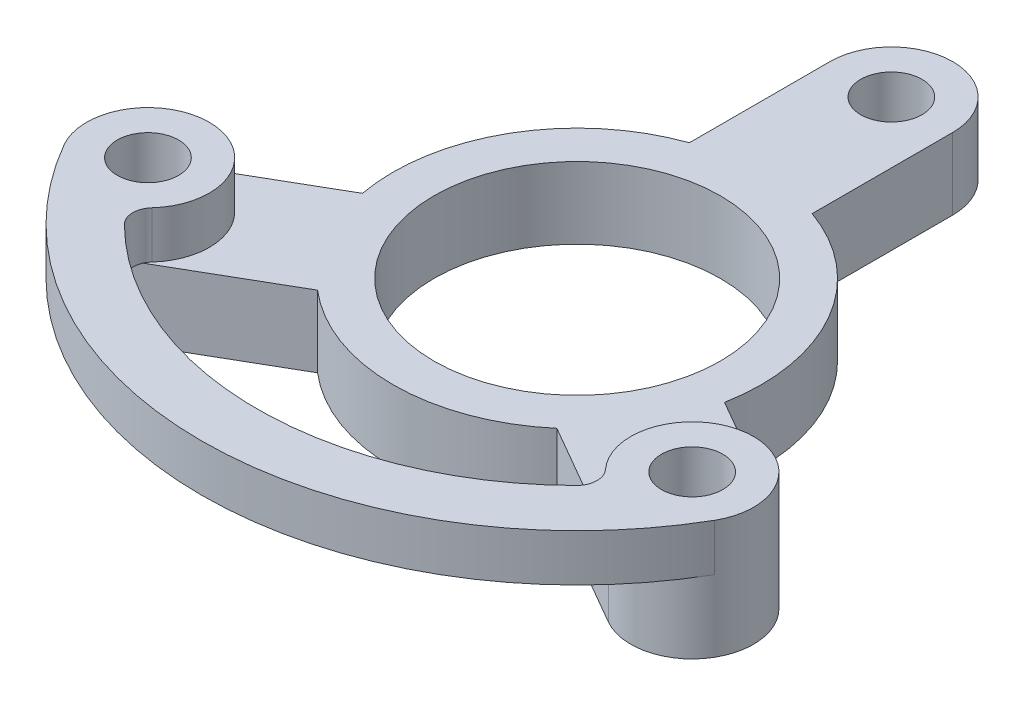
ISO-10303-21;
HEADER;
FILE_DESCRIPTION(('STEP AP214'),'2;1');
FILE_NAME('part.step','',(''),(''),'','','');
FILE_SCHEMA(('AUTOMOTIVE_DESIGN { 1 0 10303 214 1 1 1 1 }'));
ENDSEC;
DATA;
#1=APPLICATION_CONTEXT('core data for automotive mechanical design processes');
#2=APPLICATION_PROTOCOL_DEFINITION('international standard','automotive_design',2000,#1);
#3=PRODUCT_CONTEXT('',#1,'mechanical');
#4=PRODUCT('Part','Part','',(#3));
#5=PRODUCT_RELATED_PRODUCT_CATEGORY('part','',(#4));
#6=PRODUCT_DEFINITION_FORMATION('','',#4);
#7=PRODUCT_DEFINITION_CONTEXT('part definition',#1,'design');
#8=PRODUCT_DEFINITION('design','',#6,#7);
#9=PRODUCT_DEFINITION_SHAPE('','',#8);
#10=(LENGTH_UNIT() NAMED_UNIT(*) SI_UNIT(.MILLI.,.METRE.));
#11=(NAMED_UNIT(*) PLANE_ANGLE_UNIT() SI_UNIT($,.RADIAN.));
#12=(NAMED_UNIT(*) SI_UNIT($,.STERADIAN.) SOLID_ANGLE_UNIT());
#13=UNCERTAINTY_MEASURE_WITH_UNIT(LENGTH_MEASURE(1.E-05),#10,'distance_accuracy_value','');
#14=(GEOMETRIC_REPRESENTATION_CONTEXT(3) GLOBAL_UNCERTAINTY_ASSIGNED_CONTEXT((#13)) GLOBAL_UNIT_ASSIGNED_CONTEXT((#10,
#11,#12)) REPRESENTATION_CONTEXT('',''));
#15=CARTESIAN_POINT('',(0.,0.,0.));
#16=DIRECTION('',(0.,0.,1.));
#17=DIRECTION('',(1.,0.,0.));
#18=AXIS2_PLACEMENT_3D('',#15,#16,#17);
#19=CARTESIAN_POINT('',(0.,3.5,0.));
#20=DIRECTION('',(0.,-1.,0.));
#21=DIRECTION('',(0.,0.,-1.));
#22=AXIS2_PLACEMENT_3D('',#19,#20,#21);
#23=CYLINDRICAL_SURFACE('',#22,9.);
#24=CARTESIAN_POINT('',(0.,0.,0.));
#25=DIRECTION('',(0.,1.,0.));
#26=DIRECTION('',(0.,0.,1.));
#27=AXIS2_PLACEMENT_3D('',#24,#25,#26);
#28=CIRCLE('',#27,9.);
#29=CARTESIAN_POINT('',(-5.84846922834953,0.,6.8407168984726));
#30=VERTEX_POINT('',#29);
#31=CARTESIAN_POINT('',(5.84846922834954,0.,6.8407168984726));
#32=VERTEX_POINT('',#31);
#33=EDGE_CURVE('E204',#30,#32,#28,.T.);
#34=ORIENTED_EDGE('',*,*,#33,.T.);
#35=DIRECTION('',(0.,-1.,0.));
#36=VECTOR('',#35,1.);
#37=CARTESIAN_POINT('',(5.84846922834954,3.5,6.8407168984726));
#38=LINE('',#37,#36);
#39=CARTESIAN_POINT('',(5.84846922834954,3.5,6.8407168984726));
#40=VERTEX_POINT('',#39);
#41=EDGE_CURVE('E310',#40,#32,#38,.T.);
#42=ORIENTED_EDGE('',*,*,#41,.F.);
#43=CARTESIAN_POINT('',(0.,3.5,0.));
#44=DIRECTION('',(0.,1.,0.));
#45=DIRECTION('',(0.,0.,1.));
#46=AXIS2_PLACEMENT_3D('',#43,#44,#45);
#47=CIRCLE('',#46,9.);
#48=CARTESIAN_POINT('',(-5.84846922834953,3.5,6.8407168984726));
#49=VERTEX_POINT('',#48);
#50=EDGE_CURVE('E213',#49,#40,#47,.T.);
#51=ORIENTED_EDGE('',*,*,#50,.F.);
#52=DIRECTION('',(0.,-1.,0.));
#53=VECTOR('',#52,1.);
#54=CARTESIAN_POINT('',(-5.84846922834953,3.5,6.8407168984726));
#55=LINE('',#54,#53);
#56=EDGE_CURVE('E246',#49,#30,#55,.T.);
#57=ORIENTED_EDGE('',*,*,#56,.T.);
#58=EDGE_LOOP('',(#34,#42,#51,#57));
#59=FACE_BOUND('',#58,.T.);
#60=ADVANCED_FACE('F46',(#59),#23,.T.);
#61=CARTESIAN_POINT('',(-1.5,3.5,2.59807621135332));
#62=DIRECTION('',(0.5,0.,-0.866025403784439));
#63=DIRECTION('',(-0.866025403784439,0.,-0.5));
#64=AXIS2_PLACEMENT_3D('',#61,#62,#63);
#65=PLANE('',#64);
#66=DIRECTION('',(0.866025403784439,0.,0.5));
#67=VECTOR('',#66,1.);
#68=CARTESIAN_POINT('',(-1.5,0.,2.59807621135332));
#69=LINE('',#68,#67);
#70=CARTESIAN_POINT('',(11.8,0.,10.2768347915753));
#71=VERTEX_POINT('',#70);
#72=EDGE_CURVE('E250',#32,#71,#69,.T.);
#73=ORIENTED_EDGE('',*,*,#72,.T.);
#74=DIRECTION('',(0.,-1.,0.));
#75=VECTOR('',#74,1.);
#76=CARTESIAN_POINT('',(11.8,3.5,10.2768347915753));
#77=LINE('',#76,#75);
#78=CARTESIAN_POINT('',(11.8,3.5,10.2768347915753));
#79=VERTEX_POINT('',#78);
#80=EDGE_CURVE('E307',#79,#71,#77,.T.);
#81=ORIENTED_EDGE('',*,*,#80,.F.);
#82=DIRECTION('',(0.866025403784439,0.,0.5));
#83=VECTOR('',#82,1.);
#84=CARTESIAN_POINT('',(-1.5,3.5,2.59807621135332));
#85=LINE('',#84,#83);
#86=CARTESIAN_POINT('',(11.2548002587851,3.5,9.96206357422279));
#87=VERTEX_POINT('',#86);
#88=EDGE_CURVE('E61',#87,#79,#85,.T.);
#89=ORIENTED_EDGE('',*,*,#88,.F.);
#90=EDGE_CURVE('E219',#40,#87,#85,.T.);
#91=ORIENTED_EDGE('',*,*,#90,.F.);
#92=ORIENTED_EDGE('',*,*,#41,.T.);
#93=EDGE_LOOP('',(#73,#81,#89,#91,#92));
#94=FACE_BOUND('',#93,.T.);
#95=ADVANCED_FACE('F339',(#94),#65,.F.);
#96=CARTESIAN_POINT('',(13.3,3.5,7.67875858022203));
#97=DIRECTION('',(0.,-1.,0.));
#98=DIRECTION('',(0.,0.,-1.));
#99=AXIS2_PLACEMENT_3D('',#96,#97,#98);
#100=CYLINDRICAL_SURFACE('',#99,3.);
#101=CARTESIAN_POINT('',(13.3,3.5,7.67875858022203));
#102=DIRECTION('',(0.,1.,0.));
#103=DIRECTION('',(0.,0.,1.));
#104=AXIS2_PLACEMENT_3D('',#101,#102,#103);
#105=CIRCLE('',#104,3.);
#106=CARTESIAN_POINT('',(14.8,3.5,5.0806823688687));
#107=VERTEX_POINT('',#106);
#108=CARTESIAN_POINT('',(11.0821067917896,3.5,9.69889464419747));
#109=VERTEX_POINT('',#108);
#110=EDGE_CURVE('E313',#107,#109,#105,.T.);
#111=ORIENTED_EDGE('',*,*,#110,.T.);
#112=DIRECTION('',(0.,-1.,0.));
#113=VECTOR('',#112,1.);
#114=CARTESIAN_POINT('',(11.0821067917896,3.5,9.69889464419747));
#115=LINE('',#114,#113);
#116=CARTESIAN_POINT('',(11.0821067917896,5.8,9.69889464419747));
#117=VERTEX_POINT('',#116);
#118=EDGE_CURVE('E69',#109,#117,#115,.F.);
#119=ORIENTED_EDGE('',*,*,#118,.T.);
#120=CARTESIAN_POINT('',(13.3,5.8,7.67875858022203));
#121=DIRECTION('',(0.,1.,0.));
#122=DIRECTION('',(0.,0.,1.));
#123=AXIS2_PLACEMENT_3D('',#120,#121,#122);
#124=CIRCLE('',#123,3.);
#125=CARTESIAN_POINT('',(15.8980762113533,5.8,9.17875858022203));
#126=VERTEX_POINT('',#125);
#127=EDGE_CURVE('E175',#126,#117,#124,.T.);
#128=ORIENTED_EDGE('',*,*,#127,.F.);
#129=DIRECTION('',(0.,-1.,0.));
#130=VECTOR('',#129,1.);
#131=CARTESIAN_POINT('',(15.8980762113533,5.8,9.17875858022203));
#132=LINE('',#131,#130);
#133=CARTESIAN_POINT('',(15.8980762113533,3.5,9.17875858022203));
#134=VERTEX_POINT('',#133);
#135=EDGE_CURVE('E180',#126,#134,#132,.T.);
#136=ORIENTED_EDGE('',*,*,#135,.T.);
#137=CARTESIAN_POINT('',(13.3,3.5,7.67875858022203));
#138=DIRECTION('',(0.,1.,0.));
#139=DIRECTION('',(0.,0.,1.));
#140=AXIS2_PLACEMENT_3D('',#137,#138,#139);
#141=CIRCLE('',#140,3.);
#142=EDGE_CURVE('E222',#79,#134,#141,.T.);
#143=ORIENTED_EDGE('',*,*,#142,.F.);
#144=ORIENTED_EDGE('',*,*,#80,.T.);
#145=CARTESIAN_POINT('',(13.3,0.,7.67875858022203));
#146=DIRECTION('',(0.,1.,0.));
#147=DIRECTION('',(0.,0.,1.));
#148=AXIS2_PLACEMENT_3D('',#145,#146,#147);
#149=CIRCLE('',#148,3.);
#150=CARTESIAN_POINT('',(14.8,0.,5.0806823688687));
#151=VERTEX_POINT('',#150);
#152=EDGE_CURVE('E254',#71,#151,#149,.T.);
#153=ORIENTED_EDGE('',*,*,#152,.T.);
#154=DIRECTION('',(0.,-1.,0.));
#155=VECTOR('',#154,1.);
#156=CARTESIAN_POINT('',(14.8,3.5,5.0806823688687));
#157=LINE('',#156,#155);
#158=EDGE_CURVE('E305',#107,#151,#157,.T.);
#159=ORIENTED_EDGE('',*,*,#158,.F.);
#160=EDGE_LOOP('',(#111,#119,#128,#136,#143,#144,#153,#159));
#161=FACE_BOUND('',#160,.T.);
#162=ADVANCED_FACE('F177',(#161),#100,.T.);
#163=CARTESIAN_POINT('',(1.5,3.5,-2.59807621135332));
#164=DIRECTION('',(0.5,0.,-0.866025403784439));
#165=DIRECTION('',(-0.866025403784439,0.,-0.5));
#166=AXIS2_PLACEMENT_3D('',#163,#164,#165);
#167=PLANE('',#166);
#168=DIRECTION('',(0.866025403784439,0.,0.5));
#169=VECTOR('',#168,1.);
#170=CARTESIAN_POINT('',(1.5,0.,-2.59807621135332));
#171=LINE('',#170,#169);
#172=CARTESIAN_POINT('',(8.84846922834953,0.,1.64456447576597));
#173=VERTEX_POINT('',#172);
#174=EDGE_CURVE('E257',#173,#151,#171,.T.);
#175=ORIENTED_EDGE('',*,*,#174,.F.);
#176=DIRECTION('',(0.,-1.,0.));
#177=VECTOR('',#176,1.);
#178=CARTESIAN_POINT('',(8.84846922834953,3.5,1.64456447576597));
#179=LINE('',#178,#177);
#180=CARTESIAN_POINT('',(8.84846922834953,3.5,1.64456447576597));
#181=VERTEX_POINT('',#180);
#182=EDGE_CURVE('E303',#181,#173,#179,.T.);
#183=ORIENTED_EDGE('',*,*,#182,.F.);
#184=DIRECTION('',(0.866025403784439,0.,0.5));
#185=VECTOR('',#184,1.);
#186=CARTESIAN_POINT('',(1.5,3.5,-2.59807621135332));
#187=LINE('',#186,#185);
#188=EDGE_CURVE('E224',#181,#107,#187,.T.);
#189=ORIENTED_EDGE('',*,*,#188,.T.);
#190=ORIENTED_EDGE('',*,*,#158,.T.);
#191=EDGE_LOOP('',(#175,#183,#189,#190));
#192=FACE_BOUND('',#191,.T.);
#193=ADVANCED_FACE('F390',(#192),#167,.T.);
#194=CARTESIAN_POINT('',(3.,0.,-8.48528137423857));
#195=VERTEX_POINT('',#194);
#196=EDGE_CURVE('E252',#173,#195,#28,.T.);
#197=ORIENTED_EDGE('',*,*,#196,.T.);
#198=DIRECTION('',(0.,-1.,0.));
#199=VECTOR('',#198,1.);
#200=CARTESIAN_POINT('',(3.,3.5,-8.48528137423857));
#201=LINE('',#200,#199);
#202=CARTESIAN_POINT('',(3.,3.5,-8.48528137423857));
#203=VERTEX_POINT('',#202);
#204=EDGE_CURVE('E300',#203,#195,#201,.T.);
#205=ORIENTED_EDGE('',*,*,#204,.F.);
#206=EDGE_CURVE('E218',#181,#203,#47,.T.);
#207=ORIENTED_EDGE('',*,*,#206,.F.);
#208=ORIENTED_EDGE('',*,*,#182,.T.);
#209=EDGE_LOOP('',(#197,#205,#207,#208));
#210=FACE_BOUND('',#209,.T.);
#211=ADVANCED_FACE('F397',(#210),#23,.T.);
#212=CARTESIAN_POINT('',(3.,3.5,0.));
#213=DIRECTION('',(-1.,0.,0.));
#214=DIRECTION('',(0.,0.,1.));
#215=AXIS2_PLACEMENT_3D('',#212,#213,#214);
#216=PLANE('',#215);
#217=DIRECTION('',(0.,0.,-1.));
#218=VECTOR('',#217,1.);
#219=CARTESIAN_POINT('',(3.,0.,0.));
#220=LINE('',#219,#218);
#221=CARTESIAN_POINT('',(3.,0.,-15.357517160444));
#222=VERTEX_POINT('',#221);
#223=EDGE_CURVE('E260',#195,#222,#220,.T.);
#224=ORIENTED_EDGE('',*,*,#223,.T.);
#225=DIRECTION('',(0.,-1.,0.));
#226=VECTOR('',#225,1.);
#227=CARTESIAN_POINT('',(3.,3.5,-15.357517160444));
#228=LINE('',#227,#226);
#229=CARTESIAN_POINT('',(3.,3.5,-15.357517160444));
#230=VERTEX_POINT('',#229);
#231=EDGE_CURVE('E297',#230,#222,#228,.T.);
#232=ORIENTED_EDGE('',*,*,#231,.F.);
#233=DIRECTION('',(0.,0.,-1.));
#234=VECTOR('',#233,1.);
#235=CARTESIAN_POINT('',(3.,3.5,0.));
#236=LINE('',#235,#234);
#237=EDGE_CURVE('E227',#203,#230,#236,.T.);
#238=ORIENTED_EDGE('',*,*,#237,.F.);
#239=ORIENTED_EDGE('',*,*,#204,.T.);
#240=EDGE_LOOP('',(#224,#232,#238,#239));
#241=FACE_BOUND('',#240,.T.);
#242=ADVANCED_FACE('F399',(#241),#216,.F.);
#243=CARTESIAN_POINT('',(0.,3.5,-15.357517160444));
#244=DIRECTION('',(0.,-1.,0.));
#245=DIRECTION('',(0.,0.,-1.));
#246=AXIS2_PLACEMENT_3D('',#243,#244,#245);
#247=CYLINDRICAL_SURFACE('',#246,3.);
#248=CARTESIAN_POINT('',(0.,0.,-15.357517160444));
#249=DIRECTION('',(0.,1.,0.));
#250=DIRECTION('',(0.,0.,1.));
#251=AXIS2_PLACEMENT_3D('',#248,#249,#250);
#252=CIRCLE('',#251,3.);
#253=CARTESIAN_POINT('',(-3.,0.,-15.3575171604441));
#254=VERTEX_POINT('',#253);
#255=EDGE_CURVE('E262',#222,#254,#252,.T.);
#256=ORIENTED_EDGE('',*,*,#255,.T.);
#257=DIRECTION('',(0.,-1.,0.));
#258=VECTOR('',#257,1.);
#259=CARTESIAN_POINT('',(-3.,3.5,-15.3575171604441));
#260=LINE('',#259,#258);
#261=CARTESIAN_POINT('',(-3.,3.5,-15.3575171604441));
#262=VERTEX_POINT('',#261);
#263=EDGE_CURVE('E295',#262,#254,#260,.T.);
#264=ORIENTED_EDGE('',*,*,#263,.F.);
#265=CARTESIAN_POINT('',(0.,3.5,-15.357517160444));
#266=DIRECTION('',(0.,1.,0.));
#267=DIRECTION('',(0.,0.,1.));
#268=AXIS2_PLACEMENT_3D('',#265,#266,#267);
#269=CIRCLE('',#268,3.);
#270=EDGE_CURVE('E229',#230,#262,#269,.T.);
#271=ORIENTED_EDGE('',*,*,#270,.F.);
#272=ORIENTED_EDGE('',*,*,#231,.T.);
#273=EDGE_LOOP('',(#256,#264,#271,#272));
#274=FACE_BOUND('',#273,.T.);
#275=ADVANCED_FACE('F404',(#274),#247,.T.);
#276=CARTESIAN_POINT('',(-2.99999999999999,3.5,0.));
#277=DIRECTION('',(-1.,0.,0.));
#278=DIRECTION('',(0.,0.,1.));
#279=AXIS2_PLACEMENT_3D('',#276,#277,#278);
#280=PLANE('',#279);
#281=DIRECTION('',(0.,0.,-1.));
#282=VECTOR('',#281,1.);
#283=CARTESIAN_POINT('',(-2.99999999999999,0.,0.));
#284=LINE('',#283,#282);
#285=CARTESIAN_POINT('',(-3.,0.,-8.48528137423857));
#286=VERTEX_POINT('',#285);
#287=EDGE_CURVE('E265',#286,#254,#284,.T.);
#288=ORIENTED_EDGE('',*,*,#287,.F.);
#289=DIRECTION('',(0.,-1.,0.));
#290=VECTOR('',#289,1.);
#291=CARTESIAN_POINT('',(-3.,3.5,-8.48528137423857));
#292=LINE('',#291,#290);
#293=CARTESIAN_POINT('',(-3.,3.5,-8.48528137423857));
#294=VERTEX_POINT('',#293);
#295=EDGE_CURVE('E293',#294,#286,#292,.T.);
#296=ORIENTED_EDGE('',*,*,#295,.F.);
#297=DIRECTION('',(0.,0.,-1.));
#298=VECTOR('',#297,1.);
#299=CARTESIAN_POINT('',(-2.99999999999999,3.5,0.));
#300=LINE('',#299,#298);
#301=EDGE_CURVE('E231',#294,#262,#300,.T.);
#302=ORIENTED_EDGE('',*,*,#301,.T.);
#303=ORIENTED_EDGE('',*,*,#263,.T.);
#304=EDGE_LOOP('',(#288,#296,#302,#303));
#305=FACE_BOUND('',#304,.T.);
#306=ADVANCED_FACE('F406',(#305),#280,.T.);
#307=CARTESIAN_POINT('',(-8.84846922834953,0.,1.64456447576597));
#308=VERTEX_POINT('',#307);
#309=EDGE_CURVE('E251',#286,#308,#28,.T.);
#310=ORIENTED_EDGE('',*,*,#309,.T.);
#311=DIRECTION('',(0.,-1.,0.));
#312=VECTOR('',#311,1.);
#313=CARTESIAN_POINT('',(-8.84846922834953,3.5,1.64456447576597));
#314=LINE('',#313,#312);
#315=CARTESIAN_POINT('',(-8.84846922834953,3.5,1.64456447576597));
#316=VERTEX_POINT('',#315);
#317=EDGE_CURVE('E290',#316,#308,#314,.T.);
#318=ORIENTED_EDGE('',*,*,#317,.F.);
#319=EDGE_CURVE('E217',#294,#316,#47,.T.);
#320=ORIENTED_EDGE('',*,*,#319,.F.);
#321=ORIENTED_EDGE('',*,*,#295,.T.);
#322=EDGE_LOOP('',(#310,#318,#320,#321));
#323=FACE_BOUND('',#322,.T.);
#324=ADVANCED_FACE('F408',(#323),#23,.T.);
#325=CARTESIAN_POINT('',(-1.5,3.5,-2.59807621135332));
#326=DIRECTION('',(0.5,0.,0.866025403784438));
#327=DIRECTION('',(0.866025403784438,0.,-0.5));
#328=AXIS2_PLACEMENT_3D('',#325,#326,#327);
#329=PLANE('',#328);
#330=DIRECTION('',(-0.866025403784438,0.,0.5));
#331=VECTOR('',#330,1.);
#332=CARTESIAN_POINT('',(-1.5,0.,-2.59807621135332));
#333=LINE('',#332,#331);
#334=CARTESIAN_POINT('',(-14.8,0.,5.08068236886871));
#335=VERTEX_POINT('',#334);
#336=EDGE_CURVE('E268',#308,#335,#333,.T.);
#337=ORIENTED_EDGE('',*,*,#336,.T.);
#338=DIRECTION('',(0.,-1.,0.));
#339=VECTOR('',#338,1.);
#340=CARTESIAN_POINT('',(-14.8,3.5,5.08068236886871));
#341=LINE('',#340,#339);
#342=CARTESIAN_POINT('',(-14.8,3.5,5.08068236886871));
#343=VERTEX_POINT('',#342);
#344=EDGE_CURVE('E287',#343,#335,#341,.T.);
#345=ORIENTED_EDGE('',*,*,#344,.F.);
#346=DIRECTION('',(-0.866025403784438,0.,0.5));
#347=VECTOR('',#346,1.);
#348=CARTESIAN_POINT('',(-1.5,3.5,-2.59807621135332));
#349=LINE('',#348,#347);
#350=EDGE_CURVE('E234',#316,#343,#349,.T.);
#351=ORIENTED_EDGE('',*,*,#350,.F.);
#352=ORIENTED_EDGE('',*,*,#317,.T.);
#353=EDGE_LOOP('',(#337,#345,#351,#352));
#354=FACE_BOUND('',#353,.T.);
#355=ADVANCED_FACE('F373',(#354),#329,.F.);
#356=CARTESIAN_POINT('',(-13.3,3.5,7.67875858022203));
#357=DIRECTION('',(0.,-1.,0.));
#358=DIRECTION('',(0.,0.,-1.));
#359=AXIS2_PLACEMENT_3D('',#356,#357,#358);
#360=CYLINDRICAL_SURFACE('',#359,3.);
#361=CARTESIAN_POINT('',(-13.3,5.8,7.67875858022203));
#362=DIRECTION('',(0.,1.,0.));
#363=DIRECTION('',(0.,0.,1.));
#364=AXIS2_PLACEMENT_3D('',#361,#362,#363);
#365=CIRCLE('',#364,3.);
#366=CARTESIAN_POINT('',(-11.0821067917896,5.8,9.69889464419747));
#367=VERTEX_POINT('',#366);
#368=CARTESIAN_POINT('',(-15.8980762113533,5.8,9.17875858022203));
#369=VERTEX_POINT('',#368);
#370=EDGE_CURVE('E191',#367,#369,#365,.T.);
#371=ORIENTED_EDGE('',*,*,#370,.F.);
#372=DIRECTION('',(0.,-1.,0.));
#373=VECTOR('',#372,1.);
#374=CARTESIAN_POINT('',(-11.0821067917896,3.5,9.69889464419747));
#375=LINE('',#374,#373);
#376=CARTESIAN_POINT('',(-11.0821067917896,3.5,9.69889464419747));
#377=VERTEX_POINT('',#376);
#378=EDGE_CURVE('E314',#367,#377,#375,.T.);
#379=ORIENTED_EDGE('',*,*,#378,.T.);
#380=CARTESIAN_POINT('',(-13.3,3.5,7.67875858022203));
#381=DIRECTION('',(0.,1.,0.));
#382=DIRECTION('',(0.,0.,1.));
#383=AXIS2_PLACEMENT_3D('',#380,#381,#382);
#384=CIRCLE('',#383,3.);
#385=EDGE_CURVE('E195',#377,#343,#384,.T.);
#386=ORIENTED_EDGE('',*,*,#385,.T.);
#387=ORIENTED_EDGE('',*,*,#344,.T.);
#388=CARTESIAN_POINT('',(-13.3,0.,7.67875858022203));
#389=DIRECTION('',(0.,1.,0.));
#390=DIRECTION('',(0.,0.,1.));
#391=AXIS2_PLACEMENT_3D('',#388,#389,#390);
#392=CIRCLE('',#391,3.);
#393=CARTESIAN_POINT('',(-11.8,0.,10.2768347915753));
#394=VERTEX_POINT('',#393);
#395=EDGE_CURVE('E270',#335,#394,#392,.T.);
#396=ORIENTED_EDGE('',*,*,#395,.T.);
#397=DIRECTION('',(0.,-1.,0.));
#398=VECTOR('',#397,1.);
#399=CARTESIAN_POINT('',(-11.8,3.5,10.2768347915753));
#400=LINE('',#399,#398);
#401=CARTESIAN_POINT('',(-11.8,3.5,10.2768347915753));
#402=VERTEX_POINT('',#401);
#403=EDGE_CURVE('E285',#402,#394,#400,.T.);
#404=ORIENTED_EDGE('',*,*,#403,.F.);
#405=CARTESIAN_POINT('',(-13.3,3.5,7.67875858022203));
#406=DIRECTION('',(0.,1.,0.));
#407=DIRECTION('',(0.,0.,1.));
#408=AXIS2_PLACEMENT_3D('',#405,#406,#407);
#409=CIRCLE('',#408,3.);
#410=CARTESIAN_POINT('',(-15.8980762113533,3.5,9.17875858022203));
#411=VERTEX_POINT('',#410);
#412=EDGE_CURVE('E237',#411,#402,#409,.T.);
#413=ORIENTED_EDGE('',*,*,#412,.F.);
#414=DIRECTION('',(0.,-1.,0.));
#415=VECTOR('',#414,1.);
#416=CARTESIAN_POINT('',(-15.8980762113533,5.8,9.17875858022203));
#417=LINE('',#416,#415);
#418=EDGE_CURVE('E201',#369,#411,#417,.T.);
#419=ORIENTED_EDGE('',*,*,#418,.F.);
#420=EDGE_LOOP('',(#371,#379,#386,#387,#396,#404,#413,#419));
#421=FACE_BOUND('',#420,.T.);
#422=ADVANCED_FACE('F364',(#421),#360,.T.);
#423=CARTESIAN_POINT('',(0.,3.5,-15.357517160444));
#424=DIRECTION('',(0.,-1.,0.));
#425=DIRECTION('',(0.,0.,-1.));
#426=AXIS2_PLACEMENT_3D('',#423,#424,#425);
#427=CYLINDRICAL_SURFACE('',#426,1.5);
#428=CARTESIAN_POINT('',(0.,3.5,-15.357517160444));
#429=DIRECTION('',(0.,1.,0.));
#430=DIRECTION('',(0.,0.,1.));
#431=AXIS2_PLACEMENT_3D('',#428,#429,#430);
#432=CIRCLE('',#431,1.5);
#433=CARTESIAN_POINT('',(0.,3.5,-13.857517160444));
#434=VERTEX_POINT('',#433);
#435=EDGE_CURVE('E244',#434,#434,#432,.T.);
#436=ORIENTED_EDGE('',*,*,#435,.T.);
#437=EDGE_LOOP('',(#436));
#438=FACE_BOUND('',#437,.T.);
#439=CARTESIAN_POINT('',(0.,0.,-15.357517160444));
#440=DIRECTION('',(0.,1.,0.));
#441=DIRECTION('',(0.,0.,1.));
#442=AXIS2_PLACEMENT_3D('',#439,#440,#441);
#443=CIRCLE('',#442,1.5);
#444=CARTESIAN_POINT('',(0.,0.,-13.857517160444));
#445=VERTEX_POINT('',#444);
#446=EDGE_CURVE('E279',#445,#445,#443,.T.);
#447=ORIENTED_EDGE('',*,*,#446,.F.);
#448=EDGE_LOOP('',(#447));
#449=FACE_BOUND('',#448,.T.);
#450=ADVANCED_FACE('F454',(#438,#449),#427,.F.);
#451=CARTESIAN_POINT('',(13.3,3.5,7.67875858022203));
#452=DIRECTION('',(0.,-1.,0.));
#453=DIRECTION('',(0.,0.,-1.));
#454=AXIS2_PLACEMENT_3D('',#451,#452,#453);
#455=CYLINDRICAL_SURFACE('',#454,1.5);
#456=CARTESIAN_POINT('',(13.3,0.,7.67875858022203));
#457=DIRECTION('',(0.,1.,0.));
#458=DIRECTION('',(0.,0.,1.));
#459=AXIS2_PLACEMENT_3D('',#456,#457,#458);
#460=CIRCLE('',#459,1.5);
#461=CARTESIAN_POINT('',(13.3,0.,9.17875858022203));
#462=VERTEX_POINT('',#461);
#463=EDGE_CURVE('E276',#462,#462,#460,.T.);
#464=ORIENTED_EDGE('',*,*,#463,.F.);
#465=EDGE_LOOP('',(#464));
#466=FACE_BOUND('',#465,.T.);
#467=CARTESIAN_POINT('',(13.3,5.8,7.67875858022203));
#468=DIRECTION('',(0.,1.,0.));
#469=DIRECTION('',(0.,0.,1.));
#470=AXIS2_PLACEMENT_3D('',#467,#468,#469);
#471=CIRCLE('',#470,1.5);
#472=CARTESIAN_POINT('',(13.3,5.8,9.17875858022203));
#473=VERTEX_POINT('',#472);
#474=EDGE_CURVE('E206',#473,#473,#471,.F.);
#475=ORIENTED_EDGE('',*,*,#474,.F.);
#476=EDGE_LOOP('',(#475));
#477=FACE_BOUND('',#476,.T.);
#478=ADVANCED_FACE('F449',(#466,#477),#455,.F.);
#479=CARTESIAN_POINT('',(1.5,3.5,2.59807621135332));
#480=DIRECTION('',(0.5,0.,0.866025403784438));
#481=DIRECTION('',(0.866025403784438,0.,-0.5));
#482=AXIS2_PLACEMENT_3D('',#479,#480,#481);
#483=PLANE('',#482);
#484=DIRECTION('',(-0.866025403784438,0.,0.5));
#485=VECTOR('',#484,1.);
#486=CARTESIAN_POINT('',(1.5,0.,2.59807621135332));
#487=LINE('',#486,#485);
#488=EDGE_CURVE('E273',#30,#394,#487,.T.);
#489=ORIENTED_EDGE('',*,*,#488,.F.);
#490=ORIENTED_EDGE('',*,*,#56,.F.);
#491=DIRECTION('',(-0.866025403784438,0.,0.5));
#492=VECTOR('',#491,1.);
#493=CARTESIAN_POINT('',(1.5,3.5,2.59807621135332));
#494=LINE('',#493,#492);
#495=CARTESIAN_POINT('',(-11.2548002587851,3.5,9.96206357422281));
#496=VERTEX_POINT('',#495);
#497=EDGE_CURVE('E241',#49,#496,#494,.T.);
#498=ORIENTED_EDGE('',*,*,#497,.T.);
#499=EDGE_CURVE('E240',#496,#402,#494,.T.);
#500=ORIENTED_EDGE('',*,*,#499,.T.);
#501=ORIENTED_EDGE('',*,*,#403,.T.);
#502=EDGE_LOOP('',(#489,#490,#498,#500,#501));
#503=FACE_BOUND('',#502,.T.);
#504=ADVANCED_FACE('F437',(#503),#483,.T.);
#505=CARTESIAN_POINT('',(0.,3.5,0.));
#506=DIRECTION('',(0.,-1.,0.));
#507=DIRECTION('',(0.,0.,-1.));
#508=AXIS2_PLACEMENT_3D('',#505,#506,#507);
#509=CYLINDRICAL_SURFACE('',#508,7.);
#510=CARTESIAN_POINT('',(0.,3.5,0.));
#511=DIRECTION('',(0.,1.,0.));
#512=DIRECTION('',(0.,0.,1.));
#513=AXIS2_PLACEMENT_3D('',#510,#511,#512);
#514=CIRCLE('',#513,7.);
#515=CARTESIAN_POINT('',(0.,3.5,7.));
#516=VERTEX_POINT('',#515);
#517=EDGE_CURVE('E210',#516,#516,#514,.T.);
#518=ORIENTED_EDGE('',*,*,#517,.T.);
#519=EDGE_LOOP('',(#518));
#520=FACE_BOUND('',#519,.T.);
#521=CARTESIAN_POINT('',(0.,0.,0.));
#522=DIRECTION('',(0.,1.,0.));
#523=DIRECTION('',(0.,0.,1.));
#524=AXIS2_PLACEMENT_3D('',#521,#522,#523);
#525=CIRCLE('',#524,7.);
#526=CARTESIAN_POINT('',(0.,0.,7.));
#527=VERTEX_POINT('',#526);
#528=EDGE_CURVE('E200',#527,#527,#525,.T.);
#529=ORIENTED_EDGE('',*,*,#528,.F.);
#530=EDGE_LOOP('',(#529));
#531=FACE_BOUND('',#530,.T.);
#532=ADVANCED_FACE('F434',(#520,#531),#509,.F.);
#533=CARTESIAN_POINT('',(-13.3,3.5,7.67875858022203));
#534=DIRECTION('',(0.,-1.,0.));
#535=DIRECTION('',(0.,0.,-1.));
#536=AXIS2_PLACEMENT_3D('',#533,#534,#535);
#537=CYLINDRICAL_SURFACE('',#536,1.5);
#538=CARTESIAN_POINT('',(-13.3,0.,7.67875858022203));
#539=DIRECTION('',(0.,1.,0.));
#540=DIRECTION('',(0.,0.,1.));
#541=AXIS2_PLACEMENT_3D('',#538,#539,#540);
#542=CIRCLE('',#541,1.5);
#543=CARTESIAN_POINT('',(-13.3,0.,9.17875858022203));
#544=VERTEX_POINT('',#543);
#545=EDGE_CURVE('E214',#544,#544,#542,.T.);
#546=ORIENTED_EDGE('',*,*,#545,.F.);
#547=EDGE_LOOP('',(#546));
#548=FACE_BOUND('',#547,.T.);
#549=CARTESIAN_POINT('',(-13.3,5.8,7.67875858022203));
#550=DIRECTION('',(0.,1.,0.));
#551=DIRECTION('',(0.,0.,1.));
#552=AXIS2_PLACEMENT_3D('',#549,#550,#551);
#553=CIRCLE('',#552,1.5);
#554=CARTESIAN_POINT('',(-13.3,5.8,9.17875858022203));
#555=VERTEX_POINT('',#554);
#556=EDGE_CURVE('E354',#555,#555,#553,.F.);
#557=ORIENTED_EDGE('',*,*,#556,.F.);
#558=EDGE_LOOP('',(#557));
#559=FACE_BOUND('',#558,.T.);
#560=ADVANCED_FACE('F436',(#548,#559),#537,.F.);
#561=CARTESIAN_POINT('',(0.,3.5,0.));
#562=DIRECTION('',(0.,1.,0.));
#563=DIRECTION('',(0.,0.,1.));
#564=AXIS2_PLACEMENT_3D('',#561,#562,#563);
#565=PLANE('',#564);
#566=ORIENTED_EDGE('',*,*,#385,.F.);
#567=CARTESIAN_POINT('',(-10.3428090557195,3.5,10.3722733321893));
#568=DIRECTION('',(0.,1.,0.));
#569=DIRECTION('',(0.,0.,1.));
#570=AXIS2_PLACEMENT_3D('',#567,#568,#569);
#571=CIRCLE('',#570,1.);
#572=EDGE_CURVE('E319',#377,#496,#571,.T.);
#573=ORIENTED_EDGE('',*,*,#572,.T.);
#574=ORIENTED_EDGE('',*,*,#497,.F.);
#575=ORIENTED_EDGE('',*,*,#50,.T.);
#576=ORIENTED_EDGE('',*,*,#90,.T.);
#577=CARTESIAN_POINT('',(10.3428090557195,3.5,10.3722733321893));
#578=DIRECTION('',(0.,1.,0.));
#579=DIRECTION('',(0.,0.,1.));
#580=AXIS2_PLACEMENT_3D('',#577,#578,#579);
#581=CIRCLE('',#580,1.);
#582=EDGE_CURVE('E317',#87,#109,#581,.T.);
#583=ORIENTED_EDGE('',*,*,#582,.T.);
#584=ORIENTED_EDGE('',*,*,#110,.F.);
#585=ORIENTED_EDGE('',*,*,#188,.F.);
#586=ORIENTED_EDGE('',*,*,#206,.T.);
#587=ORIENTED_EDGE('',*,*,#237,.T.);
#588=ORIENTED_EDGE('',*,*,#270,.T.);
#589=ORIENTED_EDGE('',*,*,#301,.F.);
#590=ORIENTED_EDGE('',*,*,#319,.T.);
#591=ORIENTED_EDGE('',*,*,#350,.T.);
#592=EDGE_LOOP('',(#566,#573,#574,#575,#576,#583,#584,#585,#586,#587,#588,#589,#590,#591));
#593=FACE_BOUND('',#592,.T.);
#594=ORIENTED_EDGE('',*,*,#517,.F.);
#595=EDGE_LOOP('',(#594));
#596=FACE_BOUND('',#595,.T.);
#597=ORIENTED_EDGE('',*,*,#435,.F.);
#598=EDGE_LOOP('',(#597));
#599=FACE_BOUND('',#598,.T.);
#600=ADVANCED_FACE('F342',(#593,#596,#599),#565,.T.);
#601=CARTESIAN_POINT('',(0.,0.,0.));
#602=DIRECTION('',(0.,1.,0.));
#603=DIRECTION('',(0.,0.,1.));
#604=AXIS2_PLACEMENT_3D('',#601,#602,#603);
#605=PLANE('',#604);
#606=ORIENTED_EDGE('',*,*,#528,.T.);
#607=EDGE_LOOP('',(#606));
#608=FACE_BOUND('',#607,.T.);
#609=ORIENTED_EDGE('',*,*,#33,.F.);
#610=ORIENTED_EDGE('',*,*,#488,.T.);
#611=ORIENTED_EDGE('',*,*,#395,.F.);
#612=ORIENTED_EDGE('',*,*,#336,.F.);
#613=ORIENTED_EDGE('',*,*,#309,.F.);
#614=ORIENTED_EDGE('',*,*,#287,.T.);
#615=ORIENTED_EDGE('',*,*,#255,.F.);
#616=ORIENTED_EDGE('',*,*,#223,.F.);
#617=ORIENTED_EDGE('',*,*,#196,.F.);
#618=ORIENTED_EDGE('',*,*,#174,.T.);
#619=ORIENTED_EDGE('',*,*,#152,.F.);
#620=ORIENTED_EDGE('',*,*,#72,.F.);
#621=EDGE_LOOP('',(#609,#610,#611,#612,#613,#614,#615,#616,#617,#618,#619,#620));
#622=FACE_BOUND('',#621,.T.);
#623=ORIENTED_EDGE('',*,*,#463,.T.);
#624=EDGE_LOOP('',(#623));
#625=FACE_BOUND('',#624,.T.);
#626=ORIENTED_EDGE('',*,*,#446,.T.);
#627=EDGE_LOOP('',(#626));
#628=FACE_BOUND('',#627,.T.);
#629=ORIENTED_EDGE('',*,*,#545,.T.);
#630=EDGE_LOOP('',(#629));
#631=FACE_BOUND('',#630,.T.);
#632=ADVANCED_FACE('F378',(#608,#622,#625,#628,#631),#605,.F.);
#633=CARTESIAN_POINT('',(0.,3.5,0.));
#634=DIRECTION('',(0.,1.,0.));
#635=DIRECTION('',(0.,0.,1.));
#636=AXIS2_PLACEMENT_3D('',#633,#634,#635);
#637=PLANE('',#636);
#638=CARTESIAN_POINT('',(0.,3.5,0.));
#639=DIRECTION('',(0.,1.,0.));
#640=DIRECTION('',(0.,0.,1.));
#641=AXIS2_PLACEMENT_3D('',#638,#639,#640);
#642=CIRCLE('',#641,15.6477900463079);
#643=CARTESIAN_POINT('',(11.0489093632076,3.5,11.0803851565258));
#644=VERTEX_POINT('',#643);
#645=CARTESIAN_POINT('',(-11.0489093632076,3.5,11.0803851565258));
#646=VERTEX_POINT('',#645);
#647=EDGE_CURVE('E334',#644,#646,#642,.F.);
#648=ORIENTED_EDGE('',*,*,#647,.F.);
#649=CARTESIAN_POINT('',(10.3428090557195,3.5,10.3722733321893));
#650=DIRECTION('',(0.,1.,0.));
#651=DIRECTION('',(0.,0.,1.));
#652=AXIS2_PLACEMENT_3D('',#649,#650,#651);
#653=CIRCLE('',#652,1.);
#654=EDGE_CURVE('E54',#644,#87,#653,.T.);
#655=ORIENTED_EDGE('',*,*,#654,.T.);
#656=ORIENTED_EDGE('',*,*,#88,.T.);
#657=ORIENTED_EDGE('',*,*,#142,.T.);
#658=CARTESIAN_POINT('',(0.,3.5,0.));
#659=DIRECTION('',(0.,1.,0.));
#660=DIRECTION('',(0.,0.,1.));
#661=AXIS2_PLACEMENT_3D('',#658,#659,#660);
#662=CIRCLE('',#661,18.3575171604441);
#663=EDGE_CURVE('E199',#411,#134,#662,.T.);
#664=ORIENTED_EDGE('',*,*,#663,.F.);
#665=ORIENTED_EDGE('',*,*,#412,.T.);
#666=ORIENTED_EDGE('',*,*,#499,.F.);
#667=CARTESIAN_POINT('',(-10.3428090557195,3.5,10.3722733321893));
#668=DIRECTION('',(0.,1.,0.));
#669=DIRECTION('',(0.,0.,1.));
#670=AXIS2_PLACEMENT_3D('',#667,#668,#669);
#671=CIRCLE('',#670,1.);
#672=EDGE_CURVE('E328',#496,#646,#671,.T.);
#673=ORIENTED_EDGE('',*,*,#672,.T.);
#674=EDGE_LOOP('',(#648,#655,#656,#657,#664,#665,#666,#673));
#675=FACE_BOUND('',#674,.T.);
#676=ADVANCED_FACE('F332',(#675),#637,.F.);
#677=CARTESIAN_POINT('',(0.,5.8,0.));
#678=DIRECTION('',(0.,-1.,0.));
#679=DIRECTION('',(0.,0.,-1.));
#680=AXIS2_PLACEMENT_3D('',#677,#678,#679);
#681=CYLINDRICAL_SURFACE('',#680,18.3575171604441);
#682=ORIENTED_EDGE('',*,*,#663,.T.);
#683=ORIENTED_EDGE('',*,*,#135,.F.);
#684=CARTESIAN_POINT('',(0.,5.8,0.));
#685=DIRECTION('',(0.,1.,0.));
#686=DIRECTION('',(0.,0.,1.));
#687=AXIS2_PLACEMENT_3D('',#684,#685,#686);
#688=CIRCLE('',#687,18.3575171604441);
#689=EDGE_CURVE('E185',#369,#126,#688,.T.);
#690=ORIENTED_EDGE('',*,*,#689,.F.);
#691=ORIENTED_EDGE('',*,*,#418,.T.);
#692=EDGE_LOOP('',(#682,#683,#690,#691));
#693=FACE_BOUND('',#692,.T.);
#694=ADVANCED_FACE('F197',(#693),#681,.T.);
#695=CARTESIAN_POINT('',(0.,5.8,0.));
#696=DIRECTION('',(0.,-1.,0.));
#697=DIRECTION('',(0.,0.,-1.));
#698=AXIS2_PLACEMENT_3D('',#695,#696,#697);
#699=CYLINDRICAL_SURFACE('',#698,15.6477900463079);
#700=ORIENTED_EDGE('',*,*,#647,.T.);
#701=DIRECTION('',(0.,-1.,0.));
#702=VECTOR('',#701,1.);
#703=CARTESIAN_POINT('',(-11.0489093632076,5.8,11.0803851565258));
#704=LINE('',#703,#702);
#705=CARTESIAN_POINT('',(-11.0489093632076,5.8,11.0803851565258));
#706=VERTEX_POINT('',#705);
#707=EDGE_CURVE('E325',#646,#706,#704,.F.);
#708=ORIENTED_EDGE('',*,*,#707,.T.);
#709=CARTESIAN_POINT('',(0.,5.8,0.));
#710=DIRECTION('',(0.,1.,0.));
#711=DIRECTION('',(0.,0.,1.));
#712=AXIS2_PLACEMENT_3D('',#709,#710,#711);
#713=CIRCLE('',#712,15.6477900463079);
#714=CARTESIAN_POINT('',(11.0489093632076,5.8,11.0803851565258));
#715=VERTEX_POINT('',#714);
#716=EDGE_CURVE('E184',#715,#706,#713,.F.);
#717=ORIENTED_EDGE('',*,*,#716,.F.);
#718=DIRECTION('',(0.,-1.,0.));
#719=VECTOR('',#718,1.);
#720=CARTESIAN_POINT('',(11.0489093632076,5.8,11.0803851565258));
#721=LINE('',#720,#719);
#722=EDGE_CURVE('E322',#715,#644,#721,.T.);
#723=ORIENTED_EDGE('',*,*,#722,.T.);
#724=EDGE_LOOP('',(#700,#708,#717,#723));
#725=FACE_BOUND('',#724,.T.);
#726=ADVANCED_FACE('F351',(#725),#699,.F.);
#727=CARTESIAN_POINT('',(0.,5.8,0.));
#728=DIRECTION('',(0.,1.,0.));
#729=DIRECTION('',(0.,0.,1.));
#730=AXIS2_PLACEMENT_3D('',#727,#728,#729);
#731=PLANE('',#730);
#732=ORIENTED_EDGE('',*,*,#689,.T.);
#733=ORIENTED_EDGE('',*,*,#127,.T.);
#734=CARTESIAN_POINT('',(10.3428090557195,5.8,10.3722733321893));
#735=DIRECTION('',(0.,1.,0.));
#736=DIRECTION('',(0.,0.,1.));
#737=AXIS2_PLACEMENT_3D('',#734,#735,#736);
#738=CIRCLE('',#737,1.);
#739=EDGE_CURVE('E13',#117,#715,#738,.F.);
#740=ORIENTED_EDGE('',*,*,#739,.T.);
#741=ORIENTED_EDGE('',*,*,#716,.T.);
#742=CARTESIAN_POINT('',(-10.3428090557195,5.8,10.3722733321893));
#743=DIRECTION('',(0.,1.,0.));
#744=DIRECTION('',(0.,0.,1.));
#745=AXIS2_PLACEMENT_3D('',#742,#743,#744);
#746=CIRCLE('',#745,1.);
#747=EDGE_CURVE('E330',#706,#367,#746,.F.);
#748=ORIENTED_EDGE('',*,*,#747,.T.);
#749=ORIENTED_EDGE('',*,*,#370,.T.);
#750=EDGE_LOOP('',(#732,#733,#740,#741,#748,#749));
#751=FACE_BOUND('',#750,.T.);
#752=ORIENTED_EDGE('',*,*,#556,.T.);
#753=EDGE_LOOP('',(#752));
#754=FACE_BOUND('',#753,.T.);
#755=ORIENTED_EDGE('',*,*,#474,.T.);
#756=EDGE_LOOP('',(#755));
#757=FACE_BOUND('',#756,.T.);
#758=ADVANCED_FACE('F188',(#751,#754,#757),#731,.T.);
#759=CARTESIAN_POINT('',(-10.3428090557195,5.8,10.3722733321893));
#760=DIRECTION('',(0.,-1.,0.));
#761=DIRECTION('',(0.,0.,-1.));
#762=AXIS2_PLACEMENT_3D('',#759,#760,#761);
#763=CYLINDRICAL_SURFACE('',#762,1.);
#764=ORIENTED_EDGE('',*,*,#747,.F.);
#765=ORIENTED_EDGE('',*,*,#707,.F.);
#766=ORIENTED_EDGE('',*,*,#672,.F.);
#767=ORIENTED_EDGE('',*,*,#572,.F.);
#768=ORIENTED_EDGE('',*,*,#378,.F.);
#769=EDGE_LOOP('',(#764,#765,#766,#767,#768));
#770=FACE_BOUND('',#769,.T.);
#771=ADVANCED_FACE('F439',(#770),#763,.F.);
#772=CARTESIAN_POINT('',(10.3428090557195,3.5,10.3722733321893));
#773=DIRECTION('',(0.,-1.,0.));
#774=DIRECTION('',(0.,0.,-1.));
#775=AXIS2_PLACEMENT_3D('',#772,#773,#774);
#776=CYLINDRICAL_SURFACE('',#775,1.);
#777=ORIENTED_EDGE('',*,*,#739,.F.);
#778=ORIENTED_EDGE('',*,*,#118,.F.);
#779=ORIENTED_EDGE('',*,*,#582,.F.);
#780=ORIENTED_EDGE('',*,*,#654,.F.);
#781=ORIENTED_EDGE('',*,*,#722,.F.);
#782=EDGE_LOOP('',(#777,#778,#779,#780,#781));
#783=FACE_BOUND('',#782,.T.);
#784=ADVANCED_FACE('F48',(#783),#776,.F.);
#785=CLOSED_SHELL('',(#60,#95,#162,#193,#211,#242,#275,#306,#324,#355,#422,#450,#478,#504,#532,
#560,#600,#632,#676,#694,#726,#758,#771,#784));
#786=MANIFOLD_SOLID_BREP('B2',#785);
#787=ADVANCED_BREP_SHAPE_REPRESENTATION('',(#18,#786),#14);
#788=SHAPE_DEFINITION_REPRESENTATION(#9,#787);
ENDSEC;
END-ISO-10303-21;
